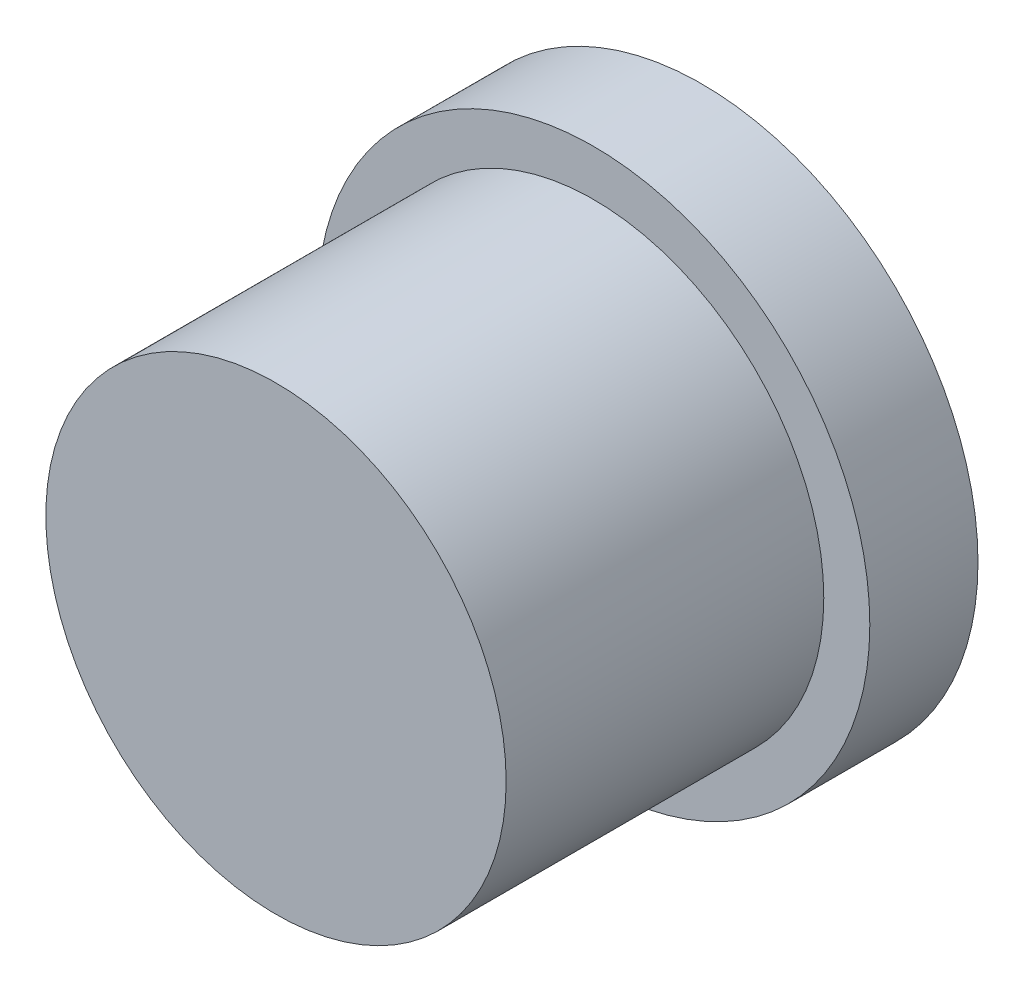
ISO-10303-21;
HEADER;
FILE_DESCRIPTION(('STEP AP214'),'2;1');
FILE_NAME('part.step','',(''),(''),'','','');
FILE_SCHEMA(('AUTOMOTIVE_DESIGN { 1 0 10303 214 1 1 1 1 }'));
ENDSEC;
DATA;
#1=APPLICATION_CONTEXT('core data for automotive mechanical design processes');
#2=APPLICATION_PROTOCOL_DEFINITION('international standard','automotive_design',2000,#1);
#3=PRODUCT_CONTEXT('',#1,'mechanical');
#4=PRODUCT('Part','Part','',(#3));
#5=PRODUCT_RELATED_PRODUCT_CATEGORY('part','',(#4));
#6=PRODUCT_DEFINITION_FORMATION('','',#4);
#7=PRODUCT_DEFINITION_CONTEXT('part definition',#1,'design');
#8=PRODUCT_DEFINITION('design','',#6,#7);
#9=PRODUCT_DEFINITION_SHAPE('','',#8);
#10=(LENGTH_UNIT() NAMED_UNIT(*) SI_UNIT(.MILLI.,.METRE.));
#11=(NAMED_UNIT(*) PLANE_ANGLE_UNIT() SI_UNIT($,.RADIAN.));
#12=(NAMED_UNIT(*) SI_UNIT($,.STERADIAN.) SOLID_ANGLE_UNIT());
#13=UNCERTAINTY_MEASURE_WITH_UNIT(LENGTH_MEASURE(1.E-05),#10,'distance_accuracy_value','');
#14=(GEOMETRIC_REPRESENTATION_CONTEXT(3) GLOBAL_UNCERTAINTY_ASSIGNED_CONTEXT((#13)) GLOBAL_UNIT_ASSIGNED_CONTEXT((#10,
#11,#12)) REPRESENTATION_CONTEXT('',''));
#15=CARTESIAN_POINT('',(0.,0.,0.));
#16=DIRECTION('',(0.,0.,1.));
#17=DIRECTION('',(1.,0.,0.));
#18=AXIS2_PLACEMENT_3D('',#15,#16,#17);
#19=CARTESIAN_POINT('',(0.,0.,9.4));
#20=DIRECTION('',(0.,0.,-1.));
#21=DIRECTION('',(-1.,0.,0.));
#22=AXIS2_PLACEMENT_3D('',#19,#20,#21);
#23=CYLINDRICAL_SURFACE('',#22,24.);
#24=CARTESIAN_POINT('',(0.,0.,9.4));
#25=DIRECTION('',(0.,0.,1.));
#26=DIRECTION('',(1.,0.,0.));
#27=AXIS2_PLACEMENT_3D('',#24,#25,#26);
#28=CIRCLE('',#27,24.);
#29=CARTESIAN_POINT('',(24.,0.,9.4));
#30=VERTEX_POINT('',#29);
#31=EDGE_CURVE('E60',#30,#30,#28,.T.);
#32=ORIENTED_EDGE('',*,*,#31,.F.);
#33=EDGE_LOOP('',(#32));
#34=FACE_BOUND('',#33,.T.);
#35=CARTESIAN_POINT('',(0.,0.,0.));
#36=DIRECTION('',(0.,0.,1.));
#37=DIRECTION('',(1.,0.,0.));
#38=AXIS2_PLACEMENT_3D('',#35,#36,#37);
#39=CIRCLE('',#38,24.);
#40=CARTESIAN_POINT('',(24.,0.,0.));
#41=VERTEX_POINT('',#40);
#42=EDGE_CURVE('E40',#41,#41,#39,.T.);
#43=ORIENTED_EDGE('',*,*,#42,.T.);
#44=EDGE_LOOP('',(#43));
#45=FACE_BOUND('',#44,.T.);
#46=ADVANCED_FACE('F37',(#34,#45),#23,.T.);
#47=CARTESIAN_POINT('',(0.,0.,9.4));
#48=DIRECTION('',(0.,0.,1.));
#49=DIRECTION('',(1.,0.,0.));
#50=AXIS2_PLACEMENT_3D('',#47,#48,#49);
#51=PLANE('',#50);
#52=CARTESIAN_POINT('',(0.,0.,9.4));
#53=DIRECTION('',(0.,0.,1.));
#54=DIRECTION('',(1.,0.,0.));
#55=AXIS2_PLACEMENT_3D('',#52,#53,#54);
#56=CIRCLE('',#55,20.);
#57=CARTESIAN_POINT('',(20.,0.,9.4));
#58=VERTEX_POINT('',#57);
#59=EDGE_CURVE('E68',#58,#58,#56,.F.);
#60=ORIENTED_EDGE('',*,*,#59,.T.);
#61=EDGE_LOOP('',(#60));
#62=FACE_BOUND('',#61,.T.);
#63=ORIENTED_EDGE('',*,*,#31,.T.);
#64=EDGE_LOOP('',(#63));
#65=FACE_BOUND('',#64,.T.);
#66=ADVANCED_FACE('F80',(#62,#65),#51,.T.);
#67=CARTESIAN_POINT('',(0.,0.,0.));
#68=DIRECTION('',(0.,0.,1.));
#69=DIRECTION('',(1.,0.,0.));
#70=AXIS2_PLACEMENT_3D('',#67,#68,#69);
#71=PLANE('',#70);
#72=CARTESIAN_POINT('',(0.,0.,0.));
#73=DIRECTION('',(0.,0.,1.));
#74=DIRECTION('',(1.,0.,0.));
#75=AXIS2_PLACEMENT_3D('',#72,#73,#74);
#76=CIRCLE('',#75,17.5);
#77=CARTESIAN_POINT('',(17.5,0.,0.));
#78=VERTEX_POINT('',#77);
#79=EDGE_CURVE('E61',#78,#78,#76,.T.);
#80=ORIENTED_EDGE('',*,*,#79,.T.);
#81=EDGE_LOOP('',(#80));
#82=FACE_BOUND('',#81,.T.);
#83=ORIENTED_EDGE('',*,*,#42,.F.);
#84=EDGE_LOOP('',(#83));
#85=FACE_BOUND('',#84,.T.);
#86=ADVANCED_FACE('F77',(#82,#85),#71,.F.);
#87=CARTESIAN_POINT('',(0.,0.,37.));
#88=DIRECTION('',(0.,0.,1.));
#89=DIRECTION('',(1.,0.,0.));
#90=AXIS2_PLACEMENT_3D('',#87,#88,#89);
#91=PLANE('',#90);
#92=CARTESIAN_POINT('',(0.,0.,37.));
#93=DIRECTION('',(0.,0.,1.));
#94=DIRECTION('',(1.,0.,0.));
#95=AXIS2_PLACEMENT_3D('',#92,#93,#94);
#96=CIRCLE('',#95,20.);
#97=CARTESIAN_POINT('',(20.,0.,37.));
#98=VERTEX_POINT('',#97);
#99=EDGE_CURVE('E65',#98,#98,#96,.T.);
#100=ORIENTED_EDGE('',*,*,#99,.T.);
#101=EDGE_LOOP('',(#100));
#102=FACE_BOUND('',#101,.T.);
#103=ADVANCED_FACE('F79',(#102),#91,.T.);
#104=CARTESIAN_POINT('',(0.,0.,37.));
#105=DIRECTION('',(0.,0.,-1.));
#106=DIRECTION('',(-1.,0.,0.));
#107=AXIS2_PLACEMENT_3D('',#104,#105,#106);
#108=CYLINDRICAL_SURFACE('',#107,20.);
#109=ORIENTED_EDGE('',*,*,#59,.F.);
#110=EDGE_LOOP('',(#109));
#111=FACE_BOUND('',#110,.T.);
#112=ORIENTED_EDGE('',*,*,#99,.F.);
#113=EDGE_LOOP('',(#112));
#114=FACE_BOUND('',#113,.T.);
#115=ADVANCED_FACE('F88',(#111,#114),#108,.T.);
#116=CARTESIAN_POINT('',(0.,12.5,-4.5));
#117=DIRECTION('',(0.,0.,1.));
#118=DIRECTION('',(1.,0.,0.));
#119=AXIS2_PLACEMENT_3D('',#116,#117,#118);
#120=CYLINDRICAL_SURFACE('',#119,1.);
#121=CARTESIAN_POINT('',(0.,12.5,-4.5));
#122=DIRECTION('',(0.,0.,1.));
#123=DIRECTION('',(1.,0.,0.));
#124=AXIS2_PLACEMENT_3D('',#121,#122,#123);
#125=CIRCLE('',#124,1.);
#126=CARTESIAN_POINT('',(1.,12.5,-4.5));
#127=VERTEX_POINT('',#126);
#128=EDGE_CURVE('E304',#127,#127,#125,.T.);
#129=ORIENTED_EDGE('',*,*,#128,.F.);
#130=EDGE_LOOP('',(#129));
#131=FACE_BOUND('',#130,.T.);
#132=CARTESIAN_POINT('',(0.,12.5,0.));
#133=DIRECTION('',(0.,0.,1.));
#134=DIRECTION('',(1.,0.,0.));
#135=AXIS2_PLACEMENT_3D('',#132,#133,#134);
#136=CIRCLE('',#135,1.);
#137=CARTESIAN_POINT('',(1.,12.5,0.));
#138=VERTEX_POINT('',#137);
#139=EDGE_CURVE('E57',#138,#138,#136,.T.);
#140=ORIENTED_EDGE('',*,*,#139,.T.);
#141=EDGE_LOOP('',(#140));
#142=FACE_BOUND('',#141,.T.);
#143=ADVANCED_FACE('F126',(#131,#142),#120,.F.);
#144=CARTESIAN_POINT('',(12.5,0.,-4.5));
#145=DIRECTION('',(0.,0.,1.));
#146=DIRECTION('',(1.,0.,0.));
#147=AXIS2_PLACEMENT_3D('',#144,#145,#146);
#148=CYLINDRICAL_SURFACE('',#147,1.);
#149=CARTESIAN_POINT('',(12.5,0.,-4.5));
#150=DIRECTION('',(0.,0.,1.));
#151=DIRECTION('',(1.,0.,0.));
#152=AXIS2_PLACEMENT_3D('',#149,#150,#151);
#153=CIRCLE('',#152,1.);
#154=CARTESIAN_POINT('',(13.5,0.,-4.5));
#155=VERTEX_POINT('',#154);
#156=EDGE_CURVE('E300',#155,#155,#153,.T.);
#157=ORIENTED_EDGE('',*,*,#156,.F.);
#158=EDGE_LOOP('',(#157));
#159=FACE_BOUND('',#158,.T.);
#160=CARTESIAN_POINT('',(12.5,0.,0.));
#161=DIRECTION('',(0.,0.,1.));
#162=DIRECTION('',(1.,0.,0.));
#163=AXIS2_PLACEMENT_3D('',#160,#161,#162);
#164=CIRCLE('',#163,1.);
#165=CARTESIAN_POINT('',(13.5,0.,0.));
#166=VERTEX_POINT('',#165);
#167=EDGE_CURVE('E49',#166,#166,#164,.T.);
#168=ORIENTED_EDGE('',*,*,#167,.T.);
#169=EDGE_LOOP('',(#168));
#170=FACE_BOUND('',#169,.T.);
#171=ADVANCED_FACE('F143',(#159,#170),#148,.F.);
#172=CARTESIAN_POINT('',(0.,-12.5,-4.5));
#173=DIRECTION('',(0.,0.,1.));
#174=DIRECTION('',(1.,0.,0.));
#175=AXIS2_PLACEMENT_3D('',#172,#173,#174);
#176=CYLINDRICAL_SURFACE('',#175,1.);
#177=CARTESIAN_POINT('',(0.,-12.5,-4.5));
#178=DIRECTION('',(0.,0.,1.));
#179=DIRECTION('',(1.,0.,0.));
#180=AXIS2_PLACEMENT_3D('',#177,#178,#179);
#181=CIRCLE('',#180,1.);
#182=CARTESIAN_POINT('',(0.999999999999913,-12.5,-4.5));
#183=VERTEX_POINT('',#182);
#184=EDGE_CURVE('E296',#183,#183,#181,.T.);
#185=ORIENTED_EDGE('',*,*,#184,.F.);
#186=EDGE_LOOP('',(#185));
#187=FACE_BOUND('',#186,.T.);
#188=CARTESIAN_POINT('',(0.,-12.5,0.));
#189=DIRECTION('',(0.,0.,1.));
#190=DIRECTION('',(1.,0.,0.));
#191=AXIS2_PLACEMENT_3D('',#188,#189,#190);
#192=CIRCLE('',#191,1.);
#193=CARTESIAN_POINT('',(0.999999999999913,-12.5,0.));
#194=VERTEX_POINT('',#193);
#195=EDGE_CURVE('E44',#194,#194,#192,.T.);
#196=ORIENTED_EDGE('',*,*,#195,.T.);
#197=EDGE_LOOP('',(#196));
#198=FACE_BOUND('',#197,.T.);
#199=ADVANCED_FACE('F155',(#187,#198),#176,.F.);
#200=CARTESIAN_POINT('',(-12.5,1.30930550206618E-13,-4.5));
#201=DIRECTION('',(0.,0.,1.));
#202=DIRECTION('',(1.,0.,0.));
#203=AXIS2_PLACEMENT_3D('',#200,#201,#202);
#204=CYLINDRICAL_SURFACE('',#203,1.);
#205=CARTESIAN_POINT('',(-12.5,1.30930550206618E-13,-4.5));
#206=DIRECTION('',(0.,0.,1.));
#207=DIRECTION('',(1.,0.,0.));
#208=AXIS2_PLACEMENT_3D('',#205,#206,#207);
#209=CIRCLE('',#208,1.);
#210=CARTESIAN_POINT('',(-11.5,1.30930550206618E-13,-4.5));
#211=VERTEX_POINT('',#210);
#212=EDGE_CURVE('E64',#211,#211,#209,.T.);
#213=ORIENTED_EDGE('',*,*,#212,.F.);
#214=EDGE_LOOP('',(#213));
#215=FACE_BOUND('',#214,.T.);
#216=CARTESIAN_POINT('',(-12.5,1.30930550206618E-13,0.));
#217=DIRECTION('',(0.,0.,1.));
#218=DIRECTION('',(1.,0.,0.));
#219=AXIS2_PLACEMENT_3D('',#216,#217,#218);
#220=CIRCLE('',#219,1.);
#221=CARTESIAN_POINT('',(-11.5,1.30930550206618E-13,0.));
#222=VERTEX_POINT('',#221);
#223=EDGE_CURVE('E10',#222,#222,#220,.T.);
#224=ORIENTED_EDGE('',*,*,#223,.T.);
#225=EDGE_LOOP('',(#224));
#226=FACE_BOUND('',#225,.T.);
#227=ADVANCED_FACE('F166',(#215,#226),#204,.F.);
#228=CARTESIAN_POINT('',(0.,0.,-4.5));
#229=DIRECTION('',(0.,0.,1.));
#230=DIRECTION('',(1.,0.,0.));
#231=AXIS2_PLACEMENT_3D('',#228,#229,#230);
#232=CYLINDRICAL_SURFACE('',#231,17.5);
#233=CARTESIAN_POINT('',(0.,0.,-4.5));
#234=DIRECTION('',(0.,0.,1.));
#235=DIRECTION('',(1.,0.,0.));
#236=AXIS2_PLACEMENT_3D('',#233,#234,#235);
#237=CIRCLE('',#236,17.5);
#238=CARTESIAN_POINT('',(17.5,0.,-4.5));
#239=VERTEX_POINT('',#238);
#240=EDGE_CURVE('E52',#239,#239,#237,.T.);
#241=ORIENTED_EDGE('',*,*,#240,.T.);
#242=EDGE_LOOP('',(#241));
#243=FACE_BOUND('',#242,.T.);
#244=ORIENTED_EDGE('',*,*,#79,.F.);
#245=EDGE_LOOP('',(#244));
#246=FACE_BOUND('',#245,.T.);
#247=ADVANCED_FACE('F177',(#243,#246),#232,.T.);
#248=CARTESIAN_POINT('',(0.,0.,-4.5));
#249=DIRECTION('',(0.,0.,1.));
#250=DIRECTION('',(1.,0.,0.));
#251=AXIS2_PLACEMENT_3D('',#248,#249,#250);
#252=PLANE('',#251);
#253=ORIENTED_EDGE('',*,*,#212,.T.);
#254=EDGE_LOOP('',(#253));
#255=FACE_BOUND('',#254,.T.);
#256=ORIENTED_EDGE('',*,*,#184,.T.);
#257=EDGE_LOOP('',(#256));
#258=FACE_BOUND('',#257,.T.);
#259=ORIENTED_EDGE('',*,*,#156,.T.);
#260=EDGE_LOOP('',(#259));
#261=FACE_BOUND('',#260,.T.);
#262=ORIENTED_EDGE('',*,*,#128,.T.);
#263=EDGE_LOOP('',(#262));
#264=FACE_BOUND('',#263,.T.);
#265=ORIENTED_EDGE('',*,*,#240,.F.);
#266=EDGE_LOOP('',(#265));
#267=FACE_BOUND('',#266,.T.);
#268=ADVANCED_FACE('F98',(#255,#258,#261,#264,#267),#252,.F.);
#269=ORIENTED_EDGE('',*,*,#139,.F.);
#270=EDGE_LOOP('',(#269));
#271=FACE_BOUND('',#270,.T.);
#272=ADVANCED_FACE('F83',(#271),#71,.F.);
#273=ORIENTED_EDGE('',*,*,#167,.F.);
#274=EDGE_LOOP('',(#273));
#275=FACE_BOUND('',#274,.T.);
#276=ADVANCED_FACE('F97',(#275),#71,.F.);
#277=ORIENTED_EDGE('',*,*,#195,.F.);
#278=EDGE_LOOP('',(#277));
#279=FACE_BOUND('',#278,.T.);
#280=ADVANCED_FACE('F94',(#279),#71,.F.);
#281=ORIENTED_EDGE('',*,*,#223,.F.);
#282=EDGE_LOOP('',(#281));
#283=FACE_BOUND('',#282,.T.);
#284=ADVANCED_FACE('F82',(#283),#71,.F.);
#285=CLOSED_SHELL('',(#46,#66,#86,#103,#115,#143,#171,#199,#227,#247,#268,#272,#276,#280,#284));
#286=MANIFOLD_SOLID_BREP('B2',#285);
#287=ADVANCED_BREP_SHAPE_REPRESENTATION('',(#18,#286),#14);
#288=SHAPE_DEFINITION_REPRESENTATION(#9,#287);
ENDSEC;
END-ISO-10303-21;
